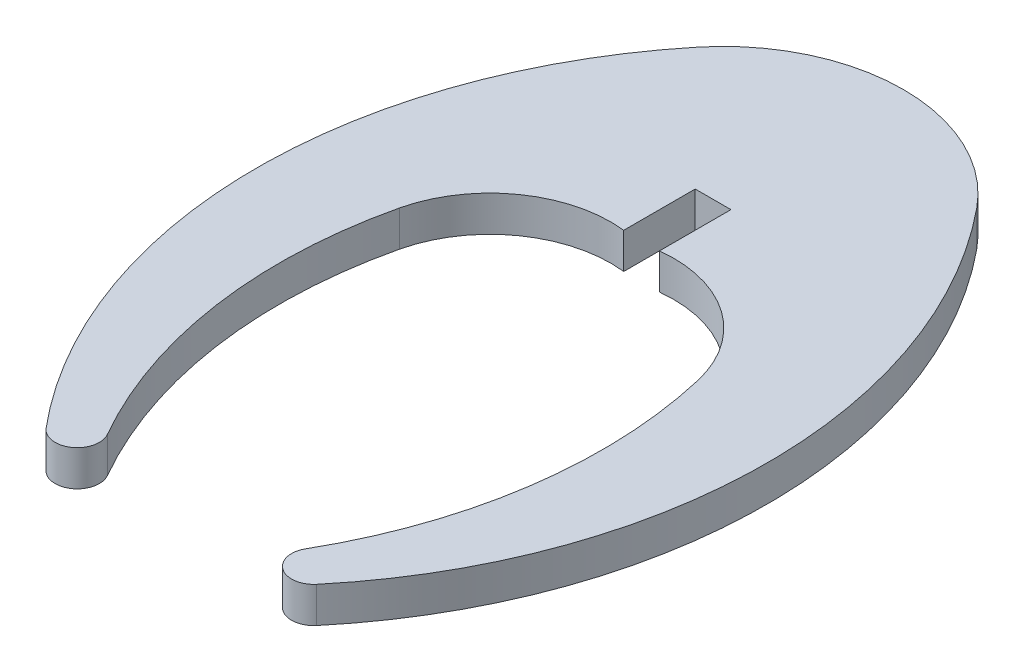
ISO-10303-21;
HEADER;
FILE_DESCRIPTION(('STEP AP214'),'2;1');
FILE_NAME('part.step','',(''),(''),'','','');
FILE_SCHEMA(('AUTOMOTIVE_DESIGN { 1 0 10303 214 1 1 1 1 }'));
ENDSEC;
DATA;
#1=APPLICATION_CONTEXT('core data for automotive mechanical design processes');
#2=APPLICATION_PROTOCOL_DEFINITION('international standard','automotive_design',2000,#1);
#3=PRODUCT_CONTEXT('',#1,'mechanical');
#4=PRODUCT('Part','Part','',(#3));
#5=PRODUCT_RELATED_PRODUCT_CATEGORY('part','',(#4));
#6=PRODUCT_DEFINITION_FORMATION('','',#4);
#7=PRODUCT_DEFINITION_CONTEXT('part definition',#1,'design');
#8=PRODUCT_DEFINITION('design','',#6,#7);
#9=PRODUCT_DEFINITION_SHAPE('','',#8);
#10=(LENGTH_UNIT() NAMED_UNIT(*) SI_UNIT(.MILLI.,.METRE.));
#11=(NAMED_UNIT(*) PLANE_ANGLE_UNIT() SI_UNIT($,.RADIAN.));
#12=(NAMED_UNIT(*) SI_UNIT($,.STERADIAN.) SOLID_ANGLE_UNIT());
#13=UNCERTAINTY_MEASURE_WITH_UNIT(LENGTH_MEASURE(1.E-05),#10,'distance_accuracy_value','');
#14=(GEOMETRIC_REPRESENTATION_CONTEXT(3) GLOBAL_UNCERTAINTY_ASSIGNED_CONTEXT((#13)) GLOBAL_UNIT_ASSIGNED_CONTEXT((#10,
#11,#12)) REPRESENTATION_CONTEXT('',''));
#15=CARTESIAN_POINT('',(0.,0.,0.));
#16=DIRECTION('',(0.,0.,1.));
#17=DIRECTION('',(1.,0.,0.));
#18=AXIS2_PLACEMENT_3D('',#15,#16,#17);
#19=CARTESIAN_POINT('',(-42090.820528,3.,-18279.410788));
#20=DIRECTION('',(-0.999999999351863,0.,-3.60037906174054E-05));
#21=DIRECTION('',(-3.60037906174054E-05,0.,0.999999999351864));
#22=AXIS2_PLACEMENT_3D('',#19,#20,#21);
#23=PLANE('',#22);
#24=DIRECTION('',(3.60037906174054E-05,0.,-0.999999999351863));
#25=VECTOR('',#24,1.);
#26=CARTESIAN_POINT('',(-42090.820528,0.,-18279.410788));
#27=LINE('',#26,#25);
#28=CARTESIAN_POINT('',(-42090.820528,0.,-18279.410788));
#29=VERTEX_POINT('',#28);
#30=CARTESIAN_POINT('',(-42090.820312,0.,-18285.410156));
#31=VERTEX_POINT('',#30);
#32=EDGE_CURVE('E155',#29,#31,#27,.T.);
#33=ORIENTED_EDGE('',*,*,#32,.T.);
#34=DIRECTION('',(0.,-1.,0.));
#35=VECTOR('',#34,1.);
#36=CARTESIAN_POINT('',(-42090.820312,3.,-18285.410156));
#37=LINE('',#36,#35);
#38=CARTESIAN_POINT('',(-42090.820312,3.,-18285.410156));
#39=VERTEX_POINT('',#38);
#40=EDGE_CURVE('E11',#39,#31,#37,.T.);
#41=ORIENTED_EDGE('',*,*,#40,.F.);
#42=DIRECTION('',(3.60037906174054E-05,0.,-0.999999999351863));
#43=VECTOR('',#42,1.);
#44=CARTESIAN_POINT('',(-42090.820528,3.,-18279.410788));
#45=LINE('',#44,#43);
#46=CARTESIAN_POINT('',(-42090.820528,3.,-18279.410788));
#47=VERTEX_POINT('',#46);
#48=EDGE_CURVE('E177',#47,#39,#45,.T.);
#49=ORIENTED_EDGE('',*,*,#48,.F.);
#50=DIRECTION('',(0.,-1.,0.));
#51=VECTOR('',#50,1.);
#52=CARTESIAN_POINT('',(-42090.820528,3.,-18279.410788));
#53=LINE('',#52,#51);
#54=EDGE_CURVE('E151',#47,#29,#53,.T.);
#55=ORIENTED_EDGE('',*,*,#54,.T.);
#56=EDGE_LOOP('',(#33,#41,#49,#55));
#57=FACE_BOUND('',#56,.T.);
#58=ADVANCED_FACE('F35',(#57),#23,.F.);
#59=CARTESIAN_POINT('',(-42090.820312,3.,-18285.410156));
#60=DIRECTION('',(-0.00065099986262607,0.,-0.999999788099567));
#61=DIRECTION('',(-0.999999788099567,0.,0.00065099986262607));
#62=AXIS2_PLACEMENT_3D('',#59,#60,#61);
#63=PLANE('',#62);
#64=DIRECTION('',(0.999999788099567,0.,-0.00065099986262607));
#65=VECTOR('',#64,1.);
#66=CARTESIAN_POINT('',(-42090.820312,0.,-18285.410156));
#67=LINE('',#66,#65);
#68=CARTESIAN_POINT('',(-42087.820312,0.,-18285.412109));
#69=VERTEX_POINT('',#68);
#70=EDGE_CURVE('E158',#31,#69,#67,.T.);
#71=ORIENTED_EDGE('',*,*,#70,.T.);
#72=DIRECTION('',(0.,-1.,0.));
#73=VECTOR('',#72,1.);
#74=CARTESIAN_POINT('',(-42087.820312,3.,-18285.412109));
#75=LINE('',#74,#73);
#76=CARTESIAN_POINT('',(-42087.820312,3.,-18285.412109));
#77=VERTEX_POINT('',#76);
#78=EDGE_CURVE('E43',#77,#69,#75,.T.);
#79=ORIENTED_EDGE('',*,*,#78,.F.);
#80=DIRECTION('',(0.999999788099567,0.,-0.00065099986262607));
#81=VECTOR('',#80,1.);
#82=CARTESIAN_POINT('',(-42090.820312,3.,-18285.410156));
#83=LINE('',#82,#81);
#84=EDGE_CURVE('E106',#39,#77,#83,.T.);
#85=ORIENTED_EDGE('',*,*,#84,.F.);
#86=ORIENTED_EDGE('',*,*,#40,.T.);
#87=EDGE_LOOP('',(#71,#79,#85,#86));
#88=FACE_BOUND('',#87,.T.);
#89=ADVANCED_FACE('F255',(#88),#63,.F.);
#90=CARTESIAN_POINT('',(-42087.820312,3.,-18285.412109));
#91=DIRECTION('',(1.,0.,3.55387046362046E-12));
#92=DIRECTION('',(3.55387046362046E-12,0.,-1.));
#93=AXIS2_PLACEMENT_3D('',#90,#91,#92);
#94=PLANE('',#93);
#95=DIRECTION('',(-3.55387046362046E-12,0.,1.));
#96=VECTOR('',#95,1.);
#97=CARTESIAN_POINT('',(-42087.820312,0.,-18285.412109));
#98=LINE('',#97,#96);
#99=CARTESIAN_POINT('',(-42087.820312,0.,-18279.414062));
#100=VERTEX_POINT('',#99);
#101=EDGE_CURVE('E160',#69,#100,#98,.T.);
#102=ORIENTED_EDGE('',*,*,#101,.T.);
#103=DIRECTION('',(0.,-1.,0.));
#104=VECTOR('',#103,1.);
#105=CARTESIAN_POINT('',(-42087.820312,3.,-18279.414062));
#106=LINE('',#105,#104);
#107=CARTESIAN_POINT('',(-42087.820312,3.,-18279.414062));
#108=VERTEX_POINT('',#107);
#109=EDGE_CURVE('E196',#108,#100,#106,.T.);
#110=ORIENTED_EDGE('',*,*,#109,.F.);
#111=DIRECTION('',(-3.55387046362046E-12,0.,1.));
#112=VECTOR('',#111,1.);
#113=CARTESIAN_POINT('',(-42087.820312,3.,-18285.412109));
#114=LINE('',#113,#112);
#115=EDGE_CURVE('E204',#77,#108,#114,.T.);
#116=ORIENTED_EDGE('',*,*,#115,.F.);
#117=ORIENTED_EDGE('',*,*,#78,.T.);
#118=EDGE_LOOP('',(#102,#110,#116,#117));
#119=FACE_BOUND('',#118,.T.);
#120=ADVANCED_FACE('F202',(#119),#94,.F.);
#121=CARTESIAN_POINT('',(-42086.6928866231,3.,-18269.3115927595));
#122=DIRECTION('',(0.,-1.,0.));
#123=DIRECTION('',(0.,0.,-1.));
#124=AXIS2_PLACEMENT_3D('',#121,#122,#123);
#125=CYLINDRICAL_SURFACE('',#124,10.1651843433987);
#126=CARTESIAN_POINT('',(-42086.6928866231,0.,-18269.3115927595));
#127=DIRECTION('',(0.,-1.,0.));
#128=DIRECTION('',(0.,0.,1.));
#129=AXIS2_PLACEMENT_3D('',#126,#127,#128);
#130=CIRCLE('',#129,10.1651843433987);
#131=CARTESIAN_POINT('',(-42076.7948740001,0.,-18271.626829));
#132=VERTEX_POINT('',#131);
#133=EDGE_CURVE('E162',#100,#132,#130,.T.);
#134=ORIENTED_EDGE('',*,*,#133,.T.);
#135=DIRECTION('',(0.,-1.,0.));
#136=VECTOR('',#135,1.);
#137=CARTESIAN_POINT('',(-42076.7948740001,3.,-18271.626829));
#138=LINE('',#137,#136);
#139=CARTESIAN_POINT('',(-42076.7948740001,3.,-18271.626829));
#140=VERTEX_POINT('',#139);
#141=EDGE_CURVE('E193',#140,#132,#138,.T.);
#142=ORIENTED_EDGE('',*,*,#141,.F.);
#143=CARTESIAN_POINT('',(-42086.6928866231,3.,-18269.3115927595));
#144=DIRECTION('',(0.,-1.,0.));
#145=DIRECTION('',(0.,0.,1.));
#146=AXIS2_PLACEMENT_3D('',#143,#144,#145);
#147=CIRCLE('',#146,10.1651843433987);
#148=EDGE_CURVE('E222',#108,#140,#147,.T.);
#149=ORIENTED_EDGE('',*,*,#148,.F.);
#150=ORIENTED_EDGE('',*,*,#109,.T.);
#151=EDGE_LOOP('',(#134,#142,#149,#150));
#152=FACE_BOUND('',#151,.T.);
#153=ADVANCED_FACE('F213',(#152),#125,.F.);
#154=CARTESIAN_POINT('',(-42115.347379136,3.,-18262.6034486479));
#155=DIRECTION('',(0.,-1.,0.));
#156=DIRECTION('',(0.,0.,-1.));
#157=AXIS2_PLACEMENT_3D('',#154,#155,#156);
#158=CYLINDRICAL_SURFACE('',#157,39.5944067418035);
#159=CARTESIAN_POINT('',(-42115.347379136,0.,-18262.6034486479));
#160=DIRECTION('',(0.,-1.,0.));
#161=DIRECTION('',(0.,0.,1.));
#162=AXIS2_PLACEMENT_3D('',#159,#160,#161);
#163=CIRCLE('',#162,39.5944067418035);
#164=CARTESIAN_POINT('',(-42081.0128680001,0.,-18242.883956));
#165=VERTEX_POINT('',#164);
#166=EDGE_CURVE('E164',#132,#165,#163,.T.);
#167=ORIENTED_EDGE('',*,*,#166,.T.);
#168=DIRECTION('',(0.,-1.,0.));
#169=VECTOR('',#168,1.);
#170=CARTESIAN_POINT('',(-42081.0128680001,3.,-18242.883956));
#171=LINE('',#170,#169);
#172=CARTESIAN_POINT('',(-42081.0128680001,3.,-18242.883956));
#173=VERTEX_POINT('',#172);
#174=EDGE_CURVE('E190',#173,#165,#171,.T.);
#175=ORIENTED_EDGE('',*,*,#174,.F.);
#176=CARTESIAN_POINT('',(-42115.347379136,3.,-18262.6034486479));
#177=DIRECTION('',(0.,-1.,0.));
#178=DIRECTION('',(0.,0.,1.));
#179=AXIS2_PLACEMENT_3D('',#176,#177,#178);
#180=CIRCLE('',#179,39.5944067418035);
#181=EDGE_CURVE('E219',#140,#173,#180,.T.);
#182=ORIENTED_EDGE('',*,*,#181,.F.);
#183=ORIENTED_EDGE('',*,*,#141,.T.);
#184=EDGE_LOOP('',(#167,#175,#182,#183));
#185=FACE_BOUND('',#184,.T.);
#186=ADVANCED_FACE('F217',(#185),#158,.F.);
#187=CARTESIAN_POINT('',(-42079.3989444143,3.,-18241.9593376721));
#188=DIRECTION('',(0.,-1.,0.));
#189=DIRECTION('',(0.,0.,-1.));
#190=AXIS2_PLACEMENT_3D('',#187,#188,#189);
#191=CYLINDRICAL_SURFACE('',#190,1.86001838510011);
#192=CARTESIAN_POINT('',(-42079.3989444143,0.,-18241.9593376721));
#193=DIRECTION('',(0.,1.,0.));
#194=DIRECTION('',(0.,0.,1.));
#195=AXIS2_PLACEMENT_3D('',#192,#193,#194);
#196=CIRCLE('',#195,1.86001838510011);
#197=CARTESIAN_POINT('',(-42077.9729450001,0.,-18240.765104));
#198=VERTEX_POINT('',#197);
#199=EDGE_CURVE('E166',#165,#198,#196,.T.);
#200=ORIENTED_EDGE('',*,*,#199,.T.);
#201=DIRECTION('',(0.,-1.,0.));
#202=VECTOR('',#201,1.);
#203=CARTESIAN_POINT('',(-42077.9729450001,3.,-18240.765104));
#204=LINE('',#203,#202);
#205=CARTESIAN_POINT('',(-42077.9729450001,3.,-18240.765104));
#206=VERTEX_POINT('',#205);
#207=EDGE_CURVE('E187',#206,#198,#204,.T.);
#208=ORIENTED_EDGE('',*,*,#207,.F.);
#209=CARTESIAN_POINT('',(-42079.3989444143,3.,-18241.9593376721));
#210=DIRECTION('',(0.,1.,0.));
#211=DIRECTION('',(0.,0.,1.));
#212=AXIS2_PLACEMENT_3D('',#209,#210,#211);
#213=CIRCLE('',#212,1.86001838510011);
#214=EDGE_CURVE('E221',#173,#206,#213,.T.);
#215=ORIENTED_EDGE('',*,*,#214,.F.);
#216=ORIENTED_EDGE('',*,*,#174,.T.);
#217=EDGE_LOOP('',(#200,#208,#215,#216));
#218=FACE_BOUND('',#217,.T.);
#219=ADVANCED_FACE('F268',(#218),#191,.T.);
#220=CARTESIAN_POINT('',(-42111.0898426385,3.,-18268.5236321368));
#221=DIRECTION('',(0.,-1.,0.));
#222=DIRECTION('',(0.,0.,-1.));
#223=AXIS2_PLACEMENT_3D('',#220,#221,#222);
#224=CYLINDRICAL_SURFACE('',#223,43.2118594081989);
#225=CARTESIAN_POINT('',(-42111.0898426385,0.,-18268.5236321368));
#226=DIRECTION('',(0.,1.,0.));
#227=DIRECTION('',(0.,0.,1.));
#228=AXIS2_PLACEMENT_3D('',#225,#226,#227);
#229=CIRCLE('',#228,43.2118594081989);
#230=CARTESIAN_POINT('',(-42077.5888019999,0.,-18295.817314));
#231=VERTEX_POINT('',#230);
#232=EDGE_CURVE('E168',#198,#231,#229,.T.);
#233=ORIENTED_EDGE('',*,*,#232,.T.);
#234=DIRECTION('',(0.,-1.,0.));
#235=VECTOR('',#234,1.);
#236=CARTESIAN_POINT('',(-42077.5888019999,3.,-18295.817314));
#237=LINE('',#236,#235);
#238=CARTESIAN_POINT('',(-42077.5888019999,3.,-18295.817314));
#239=VERTEX_POINT('',#238);
#240=EDGE_CURVE('E184',#239,#231,#237,.T.);
#241=ORIENTED_EDGE('',*,*,#240,.F.);
#242=CARTESIAN_POINT('',(-42111.0898426385,3.,-18268.5236321368));
#243=DIRECTION('',(0.,1.,0.));
#244=DIRECTION('',(0.,0.,1.));
#245=AXIS2_PLACEMENT_3D('',#242,#243,#244);
#246=CIRCLE('',#245,43.2118594081989);
#247=EDGE_CURVE('E224',#206,#239,#246,.T.);
#248=ORIENTED_EDGE('',*,*,#247,.F.);
#249=ORIENTED_EDGE('',*,*,#207,.T.);
#250=EDGE_LOOP('',(#233,#241,#248,#249));
#251=FACE_BOUND('',#250,.T.);
#252=ADVANCED_FACE('F271',(#251),#224,.T.);
#253=CARTESIAN_POINT('',(-42089.3182387382,3.,-18286.2597653866));
#254=DIRECTION('',(0.,-1.,0.));
#255=DIRECTION('',(0.,0.,-1.));
#256=AXIS2_PLACEMENT_3D('',#253,#254,#255);
#257=CYLINDRICAL_SURFACE('',#256,15.1303146593997);
#258=CARTESIAN_POINT('',(-42089.3182387382,0.,-18286.2597653866));
#259=DIRECTION('',(0.,1.,0.));
#260=DIRECTION('',(0.,0.,1.));
#261=AXIS2_PLACEMENT_3D('',#258,#259,#260);
#262=CIRCLE('',#261,15.1303146593997);
#263=CARTESIAN_POINT('',(-42101.04196,0.,-18295.824324));
#264=VERTEX_POINT('',#263);
#265=EDGE_CURVE('E170',#231,#264,#262,.T.);
#266=ORIENTED_EDGE('',*,*,#265,.T.);
#267=DIRECTION('',(0.,-1.,0.));
#268=VECTOR('',#267,1.);
#269=CARTESIAN_POINT('',(-42101.04196,3.,-18295.824324));
#270=LINE('',#269,#268);
#271=CARTESIAN_POINT('',(-42101.04196,3.,-18295.824324));
#272=VERTEX_POINT('',#271);
#273=EDGE_CURVE('E181',#272,#264,#270,.T.);
#274=ORIENTED_EDGE('',*,*,#273,.F.);
#275=CARTESIAN_POINT('',(-42089.3182387382,3.,-18286.2597653866));
#276=DIRECTION('',(0.,1.,0.));
#277=DIRECTION('',(0.,0.,1.));
#278=AXIS2_PLACEMENT_3D('',#275,#276,#277);
#279=CIRCLE('',#278,15.1303146593997);
#280=EDGE_CURVE('E230',#239,#272,#279,.T.);
#281=ORIENTED_EDGE('',*,*,#280,.F.);
#282=ORIENTED_EDGE('',*,*,#240,.T.);
#283=EDGE_LOOP('',(#266,#274,#281,#282));
#284=FACE_BOUND('',#283,.T.);
#285=ADVANCED_FACE('F236',(#284),#257,.T.);
#286=CARTESIAN_POINT('',(-42067.55469282,3.,-18268.512630289));
#287=DIRECTION('',(0.,-1.,0.));
#288=DIRECTION('',(0.,0.,-1.));
#289=AXIS2_PLACEMENT_3D('',#286,#287,#288);
#290=CYLINDRICAL_SURFACE('',#289,43.212563873804);
#291=CARTESIAN_POINT('',(-42067.55469282,0.,-18268.512630289));
#292=DIRECTION('',(0.,1.,0.));
#293=DIRECTION('',(0.,0.,1.));
#294=AXIS2_PLACEMENT_3D('',#291,#292,#293);
#295=CIRCLE('',#294,43.212563873804);
#296=CARTESIAN_POINT('',(-42100.690387,0.,-18240.775445));
#297=VERTEX_POINT('',#296);
#298=EDGE_CURVE('E172',#264,#297,#295,.T.);
#299=ORIENTED_EDGE('',*,*,#298,.T.);
#300=DIRECTION('',(0.,-1.,0.));
#301=VECTOR('',#300,1.);
#302=CARTESIAN_POINT('',(-42100.690387,3.,-18240.775445));
#303=LINE('',#302,#301);
#304=CARTESIAN_POINT('',(-42100.690387,3.,-18240.775445));
#305=VERTEX_POINT('',#304);
#306=EDGE_CURVE('E146',#305,#297,#303,.T.);
#307=ORIENTED_EDGE('',*,*,#306,.F.);
#308=CARTESIAN_POINT('',(-42067.55469282,3.,-18268.512630289));
#309=DIRECTION('',(0.,1.,0.));
#310=DIRECTION('',(0.,0.,1.));
#311=AXIS2_PLACEMENT_3D('',#308,#309,#310);
#312=CIRCLE('',#311,43.212563873804);
#313=EDGE_CURVE('E137',#272,#305,#312,.T.);
#314=ORIENTED_EDGE('',*,*,#313,.F.);
#315=ORIENTED_EDGE('',*,*,#273,.T.);
#316=EDGE_LOOP('',(#299,#307,#314,#315));
#317=FACE_BOUND('',#316,.T.);
#318=ADVANCED_FACE('F240',(#317),#290,.T.);
#319=CARTESIAN_POINT('',(-42099.2668809699,3.,-18241.9666884116));
#320=DIRECTION('',(0.,-1.,0.));
#321=DIRECTION('',(0.,0.,-1.));
#322=AXIS2_PLACEMENT_3D('',#319,#320,#321);
#323=CYLINDRICAL_SURFACE('',#322,1.85618702810045);
#324=CARTESIAN_POINT('',(-42099.2668809699,0.,-18241.9666884116));
#325=DIRECTION('',(0.,1.,0.));
#326=DIRECTION('',(0.,0.,1.));
#327=AXIS2_PLACEMENT_3D('',#324,#325,#326);
#328=CIRCLE('',#327,1.85618702810045);
#329=CARTESIAN_POINT('',(-42097.655369,0.,-18242.887807));
#330=VERTEX_POINT('',#329);
#331=EDGE_CURVE('E145',#297,#330,#328,.T.);
#332=ORIENTED_EDGE('',*,*,#331,.T.);
#333=DIRECTION('',(0.,-1.,0.));
#334=VECTOR('',#333,1.);
#335=CARTESIAN_POINT('',(-42097.655369,3.,-18242.887807));
#336=LINE('',#335,#334);
#337=CARTESIAN_POINT('',(-42097.655369,3.,-18242.887807));
#338=VERTEX_POINT('',#337);
#339=EDGE_CURVE('E142',#338,#330,#336,.T.);
#340=ORIENTED_EDGE('',*,*,#339,.F.);
#341=CARTESIAN_POINT('',(-42099.2668809699,3.,-18241.9666884116));
#342=DIRECTION('',(0.,1.,0.));
#343=DIRECTION('',(0.,0.,1.));
#344=AXIS2_PLACEMENT_3D('',#341,#342,#343);
#345=CIRCLE('',#344,1.85618702810045);
#346=EDGE_CURVE('E131',#305,#338,#345,.T.);
#347=ORIENTED_EDGE('',*,*,#346,.F.);
#348=ORIENTED_EDGE('',*,*,#306,.T.);
#349=EDGE_LOOP('',(#332,#340,#347,#348));
#350=FACE_BOUND('',#349,.T.);
#351=ADVANCED_FACE('F143',(#350),#323,.T.);
#352=CARTESIAN_POINT('',(-42063.3086471705,3.,-18262.5843479844));
#353=DIRECTION('',(0.,-1.,0.));
#354=DIRECTION('',(0.,0.,-1.));
#355=AXIS2_PLACEMENT_3D('',#352,#353,#354);
#356=CYLINDRICAL_SURFACE('',#355,39.5935730540668);
#357=CARTESIAN_POINT('',(-42063.3086471705,0.,-18262.5843479844));
#358=DIRECTION('',(0.,-1.,0.));
#359=DIRECTION('',(0.,0.,1.));
#360=AXIS2_PLACEMENT_3D('',#357,#358,#359);
#361=CIRCLE('',#360,39.5935730540668);
#362=CARTESIAN_POINT('',(-42101.854415,0.,-18271.632818));
#363=VERTEX_POINT('',#362);
#364=EDGE_CURVE('E92',#330,#363,#361,.T.);
#365=ORIENTED_EDGE('',*,*,#364,.T.);
#366=DIRECTION('',(0.,-1.,0.));
#367=VECTOR('',#366,1.);
#368=CARTESIAN_POINT('',(-42101.854415,3.,-18271.632818));
#369=LINE('',#368,#367);
#370=CARTESIAN_POINT('',(-42101.854415,3.,-18271.632818));
#371=VERTEX_POINT('',#370);
#372=EDGE_CURVE('E147',#371,#363,#369,.T.);
#373=ORIENTED_EDGE('',*,*,#372,.F.);
#374=CARTESIAN_POINT('',(-42063.3086471705,3.,-18262.5843479844));
#375=DIRECTION('',(0.,-1.,0.));
#376=DIRECTION('',(0.,0.,1.));
#377=AXIS2_PLACEMENT_3D('',#374,#375,#376);
#378=CIRCLE('',#377,39.5935730540668);
#379=EDGE_CURVE('E135',#338,#371,#378,.T.);
#380=ORIENTED_EDGE('',*,*,#379,.F.);
#381=ORIENTED_EDGE('',*,*,#339,.T.);
#382=EDGE_LOOP('',(#365,#373,#380,#381));
#383=FACE_BOUND('',#382,.T.);
#384=ADVANCED_FACE('F149',(#383),#356,.F.);
#385=CARTESIAN_POINT('',(-42091.9583825198,3.,-18269.3095942912));
#386=DIRECTION('',(0.,-1.,0.));
#387=DIRECTION('',(0.,0.,-1.));
#388=AXIS2_PLACEMENT_3D('',#385,#386,#387);
#389=CYLINDRICAL_SURFACE('',#388,10.1650788118014);
#390=CARTESIAN_POINT('',(-42091.9583825198,0.,-18269.3095942912));
#391=DIRECTION('',(0.,-1.,0.));
#392=DIRECTION('',(0.,0.,1.));
#393=AXIS2_PLACEMENT_3D('',#390,#391,#392);
#394=CIRCLE('',#393,10.1650788118014);
#395=EDGE_CURVE('E98',#363,#29,#394,.T.);
#396=ORIENTED_EDGE('',*,*,#395,.T.);
#397=ORIENTED_EDGE('',*,*,#54,.F.);
#398=CARTESIAN_POINT('',(-42091.9583825198,3.,-18269.3095942912));
#399=DIRECTION('',(0.,-1.,0.));
#400=DIRECTION('',(0.,0.,1.));
#401=AXIS2_PLACEMENT_3D('',#398,#399,#400);
#402=CIRCLE('',#401,10.1650788118014);
#403=EDGE_CURVE('E51',#371,#47,#402,.T.);
#404=ORIENTED_EDGE('',*,*,#403,.F.);
#405=ORIENTED_EDGE('',*,*,#372,.T.);
#406=EDGE_LOOP('',(#396,#397,#404,#405));
#407=FACE_BOUND('',#406,.T.);
#408=ADVANCED_FACE('F244',(#407),#389,.F.);
#409=CARTESIAN_POINT('',(-42086.6928866231,3.,-18269.3115927595));
#410=DIRECTION('',(0.,1.,0.));
#411=DIRECTION('',(0.,0.,1.));
#412=AXIS2_PLACEMENT_3D('',#409,#410,#411);
#413=PLANE('',#412);
#414=ORIENTED_EDGE('',*,*,#48,.T.);
#415=ORIENTED_EDGE('',*,*,#84,.T.);
#416=ORIENTED_EDGE('',*,*,#115,.T.);
#417=ORIENTED_EDGE('',*,*,#148,.T.);
#418=ORIENTED_EDGE('',*,*,#181,.T.);
#419=ORIENTED_EDGE('',*,*,#214,.T.);
#420=ORIENTED_EDGE('',*,*,#247,.T.);
#421=ORIENTED_EDGE('',*,*,#280,.T.);
#422=ORIENTED_EDGE('',*,*,#313,.T.);
#423=ORIENTED_EDGE('',*,*,#346,.T.);
#424=ORIENTED_EDGE('',*,*,#379,.T.);
#425=ORIENTED_EDGE('',*,*,#403,.T.);
#426=EDGE_LOOP('',(#414,#415,#416,#417,#418,#419,#420,#421,#422,#423,#424,#425));
#427=FACE_BOUND('',#426,.T.);
#428=ADVANCED_FACE('F133',(#427),#413,.T.);
#429=CARTESIAN_POINT('',(-42086.6928866231,0.,-18269.3115927595));
#430=DIRECTION('',(0.,1.,0.));
#431=DIRECTION('',(0.,0.,1.));
#432=AXIS2_PLACEMENT_3D('',#429,#430,#431);
#433=PLANE('',#432);
#434=ORIENTED_EDGE('',*,*,#32,.F.);
#435=ORIENTED_EDGE('',*,*,#395,.F.);
#436=ORIENTED_EDGE('',*,*,#364,.F.);
#437=ORIENTED_EDGE('',*,*,#331,.F.);
#438=ORIENTED_EDGE('',*,*,#298,.F.);
#439=ORIENTED_EDGE('',*,*,#265,.F.);
#440=ORIENTED_EDGE('',*,*,#232,.F.);
#441=ORIENTED_EDGE('',*,*,#199,.F.);
#442=ORIENTED_EDGE('',*,*,#166,.F.);
#443=ORIENTED_EDGE('',*,*,#133,.F.);
#444=ORIENTED_EDGE('',*,*,#101,.F.);
#445=ORIENTED_EDGE('',*,*,#70,.F.);
#446=EDGE_LOOP('',(#434,#435,#436,#437,#438,#439,#440,#441,#442,#443,#444,#445));
#447=FACE_BOUND('',#446,.T.);
#448=ADVANCED_FACE('F208',(#447),#433,.F.);
#449=CLOSED_SHELL('',(#58,#89,#120,#153,#186,#219,#252,#285,#318,#351,#384,#408,#428,#448));
#450=MANIFOLD_SOLID_BREP('B2',#449);
#451=ADVANCED_BREP_SHAPE_REPRESENTATION('',(#18,#450),#14);
#452=SHAPE_DEFINITION_REPRESENTATION(#9,#451);
ENDSEC;
END-ISO-10303-21;
